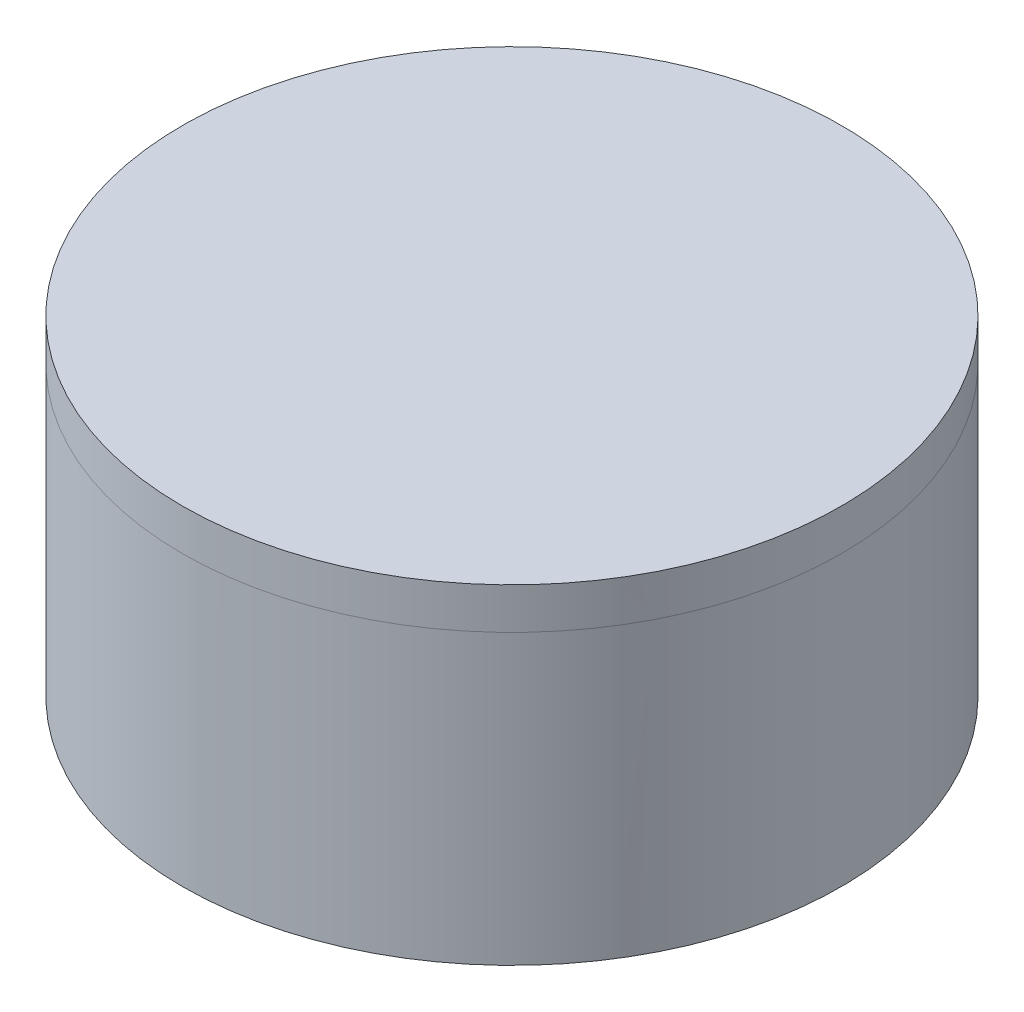
ISO-10303-21;
HEADER;
FILE_DESCRIPTION(('STEP AP214'),'2;1');
FILE_NAME('part.step','',(''),(''),'','','');
FILE_SCHEMA(('AUTOMOTIVE_DESIGN { 1 0 10303 214 1 1 1 1 }'));
ENDSEC;
DATA;
#1=APPLICATION_CONTEXT('core data for automotive mechanical design processes');
#2=APPLICATION_PROTOCOL_DEFINITION('international standard','automotive_design',2000,#1);
#3=PRODUCT_CONTEXT('',#1,'mechanical');
#4=PRODUCT('Part','Part','',(#3));
#5=PRODUCT_RELATED_PRODUCT_CATEGORY('part','',(#4));
#6=PRODUCT_DEFINITION_FORMATION('','',#4);
#7=PRODUCT_DEFINITION_CONTEXT('part definition',#1,'design');
#8=PRODUCT_DEFINITION('design','',#6,#7);
#9=PRODUCT_DEFINITION_SHAPE('','',#8);
#10=(LENGTH_UNIT() NAMED_UNIT(*) SI_UNIT(.MILLI.,.METRE.));
#11=(NAMED_UNIT(*) PLANE_ANGLE_UNIT() SI_UNIT($,.RADIAN.));
#12=(NAMED_UNIT(*) SI_UNIT($,.STERADIAN.) SOLID_ANGLE_UNIT());
#13=UNCERTAINTY_MEASURE_WITH_UNIT(LENGTH_MEASURE(1.E-05),#10,'distance_accuracy_value','');
#14=(GEOMETRIC_REPRESENTATION_CONTEXT(3) GLOBAL_UNCERTAINTY_ASSIGNED_CONTEXT((#13)) GLOBAL_UNIT_ASSIGNED_CONTEXT((#10,
#11,#12)) REPRESENTATION_CONTEXT('',''));
#15=CARTESIAN_POINT('',(0.,0.,0.));
#16=DIRECTION('',(0.,0.,1.));
#17=DIRECTION('',(1.,0.,0.));
#18=AXIS2_PLACEMENT_3D('',#15,#16,#17);
#19=CARTESIAN_POINT('',(0.,22.9999994859099,0.));
#20=DIRECTION('',(0.,-1.,0.));
#21=DIRECTION('',(0.,0.,-1.));
#22=AXIS2_PLACEMENT_3D('',#19,#20,#21);
#23=PLANE('',#22);
#24=CARTESIAN_POINT('',(0.,22.9999994859099,0.));
#25=DIRECTION('',(0.,-1.,0.));
#26=DIRECTION('',(0.,0.,-1.));
#27=AXIS2_PLACEMENT_3D('',#24,#25,#26);
#28=CIRCLE('',#27,40.);
#29=CARTESIAN_POINT('',(0.,22.9999994859099,-40.));
#30=VERTEX_POINT('',#29);
#31=EDGE_CURVE('E52',#30,#30,#28,.F.);
#32=ORIENTED_EDGE('',*,*,#31,.F.);
#33=EDGE_LOOP('',(#32));
#34=FACE_BOUND('',#33,.T.);
#35=ADVANCED_FACE('F48',(#34),#23,.T.);
#36=CARTESIAN_POINT('',(0.,27.9999994859099,0.));
#37=DIRECTION('',(0.,1.,0.));
#38=DIRECTION('',(0.,0.,1.));
#39=AXIS2_PLACEMENT_3D('',#36,#37,#38);
#40=PLANE('',#39);
#41=CARTESIAN_POINT('',(0.,27.9999994859099,0.));
#42=DIRECTION('',(0.,1.,0.));
#43=DIRECTION('',(0.,0.,1.));
#44=AXIS2_PLACEMENT_3D('',#41,#42,#43);
#45=CIRCLE('',#44,40.);
#46=CARTESIAN_POINT('',(0.,27.9999994859099,40.));
#47=VERTEX_POINT('',#46);
#48=EDGE_CURVE('E11',#47,#47,#45,.T.);
#49=ORIENTED_EDGE('',*,*,#48,.T.);
#50=EDGE_LOOP('',(#49));
#51=FACE_BOUND('',#50,.T.);
#52=ADVANCED_FACE('F63',(#51),#40,.T.);
#53=CARTESIAN_POINT('',(0.,-12.0000005140901,0.));
#54=DIRECTION('',(0.,1.,0.));
#55=DIRECTION('',(0.,0.,1.));
#56=AXIS2_PLACEMENT_3D('',#53,#54,#55);
#57=CYLINDRICAL_SURFACE('',#56,40.);
#58=ORIENTED_EDGE('',*,*,#48,.F.);
#59=EDGE_LOOP('',(#58));
#60=FACE_BOUND('',#59,.T.);
#61=ORIENTED_EDGE('',*,*,#31,.T.);
#62=EDGE_LOOP('',(#61));
#63=FACE_BOUND('',#62,.T.);
#64=ADVANCED_FACE('F50',(#60,#63),#57,.T.);
#65=CLOSED_SHELL('',(#35,#52,#64));
#66=MANIFOLD_SOLID_BREP('B2',#65);
#67=CARTESIAN_POINT('',(0.,22.9999994859099,0.));
#68=DIRECTION('',(0.,-1.,0.));
#69=DIRECTION('',(0.,0.,-1.));
#70=AXIS2_PLACEMENT_3D('',#67,#68,#69);
#71=PLANE('',#70);
#72=CARTESIAN_POINT('',(0.,22.9999994859099,0.));
#73=DIRECTION('',(0.,-1.,0.));
#74=DIRECTION('',(1.,0.,0.));
#75=AXIS2_PLACEMENT_3D('',#72,#73,#74);
#76=CIRCLE('',#75,34.9999992735684);
#77=CARTESIAN_POINT('',(-34.9999992735684,22.9999994859099,0.));
#78=VERTEX_POINT('',#77);
#79=EDGE_CURVE('E46',#78,#78,#76,.T.);
#80=ORIENTED_EDGE('',*,*,#79,.T.);
#81=EDGE_LOOP('',(#80));
#82=FACE_BOUND('',#81,.T.);
#83=CARTESIAN_POINT('',(0.,22.9999994859099,0.));
#84=DIRECTION('',(0.,-1.,0.));
#85=DIRECTION('',(0.,0.,-1.));
#86=AXIS2_PLACEMENT_3D('',#83,#84,#85);
#87=CIRCLE('',#86,40.);
#88=CARTESIAN_POINT('',(0.,22.9999994859099,-40.));
#89=VERTEX_POINT('',#88);
#90=EDGE_CURVE('E116',#89,#89,#87,.F.);
#91=ORIENTED_EDGE('',*,*,#90,.T.);
#92=EDGE_LOOP('',(#91));
#93=FACE_BOUND('',#92,.T.);
#94=ADVANCED_FACE('F113',(#82,#93),#71,.F.);
#95=CARTESIAN_POINT('',(0.,22.9999994859099,0.));
#96=DIRECTION('',(0.,-1.,0.));
#97=DIRECTION('',(1.,0.,0.));
#98=AXIS2_PLACEMENT_3D('',#95,#96,#97);
#99=CIRCLE('',#98,32.4999992735684);
#100=CARTESIAN_POINT('',(-32.4999992735684,22.9999994859099,0.));
#101=VERTEX_POINT('',#100);
#102=EDGE_CURVE('E269',#101,#101,#99,.T.);
#103=ORIENTED_EDGE('',*,*,#102,.F.);
#104=EDGE_LOOP('',(#103));
#105=FACE_BOUND('',#104,.T.);
#106=ADVANCED_FACE('F332',(#105),#71,.F.);
#107=CARTESIAN_POINT('',(7.00000010430813,22.4999994970858,0.));
#108=DIRECTION('',(0.,1.,0.));
#109=DIRECTION('',(1.,0.,0.));
#110=AXIS2_PLACEMENT_3D('',#107,#108,#109);
#111=PLANE('',#110);
#112=CARTESIAN_POINT('',(0.,22.4999994970858,0.));
#113=DIRECTION('',(0.,-1.,0.));
#114=DIRECTION('',(1.,0.,0.));
#115=AXIS2_PLACEMENT_3D('',#112,#113,#114);
#116=CIRCLE('',#115,7.00000010430813);
#117=CARTESIAN_POINT('',(-7.00000010430814,22.4999994970858,0.));
#118=VERTEX_POINT('',#117);
#119=EDGE_CURVE('E296',#118,#118,#116,.T.);
#120=ORIENTED_EDGE('',*,*,#119,.T.);
#121=EDGE_LOOP('',(#120));
#122=FACE_BOUND('',#121,.T.);
#123=CARTESIAN_POINT('',(0.,22.4999994970858,0.));
#124=DIRECTION('',(0.,-1.,0.));
#125=DIRECTION('',(1.,0.,0.));
#126=AXIS2_PLACEMENT_3D('',#123,#124,#125);
#127=CIRCLE('',#126,5.00000026077048);
#128=CARTESIAN_POINT('',(-5.0000002607703,22.4999994970858,0.));
#129=VERTEX_POINT('',#128);
#130=EDGE_CURVE('E253',#129,#129,#127,.T.);
#131=ORIENTED_EDGE('',*,*,#130,.F.);
#132=EDGE_LOOP('',(#131));
#133=FACE_BOUND('',#132,.T.);
#134=ADVANCED_FACE('F340',(#122,#133),#111,.F.);
#135=CARTESIAN_POINT('',(0.,18.7499998603016,0.));
#136=DIRECTION('',(0.,-1.,0.));
#137=DIRECTION('',(1.,0.,0.));
#138=AXIS2_PLACEMENT_3D('',#135,#136,#137);
#139=CYLINDRICAL_SURFACE('',#138,5.0000002607703);
#140=CARTESIAN_POINT('',(0.,15.0000002235174,0.));
#141=DIRECTION('',(0.,-1.,0.));
#142=DIRECTION('',(1.,0.,0.));
#143=AXIS2_PLACEMENT_3D('',#140,#141,#142);
#144=CIRCLE('',#143,5.00000026077035);
#145=CARTESIAN_POINT('',(-5.0000002607703,15.0000002235174,0.));
#146=VERTEX_POINT('',#145);
#147=EDGE_CURVE('E252',#146,#146,#144,.T.);
#148=ORIENTED_EDGE('',*,*,#147,.F.);
#149=DIRECTION('',(0.,1.,0.));
#150=VECTOR('',#149,1.);
#151=CARTESIAN_POINT('',(-5.0000002607703,18.7499998603016,0.));
#152=LINE('',#151,#150);
#153=EDGE_CURVE('E249',#146,#129,#152,.T.);
#154=ORIENTED_EDGE('',*,*,#153,.T.);
#155=ORIENTED_EDGE('',*,*,#130,.T.);
#156=ORIENTED_EDGE('',*,*,#153,.F.);
#157=EDGE_LOOP('',(#148,#154,#155,#156));
#158=FACE_BOUND('',#157,.T.);
#159=ADVANCED_FACE('F345',(#158),#139,.T.);
#160=CARTESIAN_POINT('',(5.00000026077035,15.0000002235174,0.));
#161=DIRECTION('',(0.,-1.,0.));
#162=DIRECTION('',(0.,0.,-1.));
#163=AXIS2_PLACEMENT_3D('',#160,#161,#162);
#164=PLANE('',#163);
#165=CARTESIAN_POINT('',(0.,15.0000002235174,0.));
#166=DIRECTION('',(0.,-1.,0.));
#167=DIRECTION('',(1.,0.,0.));
#168=AXIS2_PLACEMENT_3D('',#165,#166,#167);
#169=CIRCLE('',#168,7.00000010430812);
#170=CARTESIAN_POINT('',(7.00000010430812,15.0000002235174,0.));
#171=VERTEX_POINT('',#170);
#172=EDGE_CURVE('E372',#171,#171,#169,.T.);
#173=ORIENTED_EDGE('',*,*,#172,.F.);
#174=EDGE_LOOP('',(#173));
#175=FACE_BOUND('',#174,.T.);
#176=ORIENTED_EDGE('',*,*,#147,.T.);
#177=EDGE_LOOP('',(#176));
#178=FACE_BOUND('',#177,.T.);
#179=ADVANCED_FACE('F492',(#175,#178),#164,.F.);
#180=CARTESIAN_POINT('',(7.00000010430812,15.0000002235174,0.));
#181=CARTESIAN_POINT('',(7.00000010430813,15.0000002235174,7.00000010430813));
#182=CARTESIAN_POINT('',(0.,15.0000002235174,7.00000010430812));
#183=CARTESIAN_POINT('',(-7.00000010430813,15.0000002235174,7.00000010430813));
#184=CARTESIAN_POINT('',(-7.00000010430812,15.0000002235174,0.));
#185=CARTESIAN_POINT('',(-7.00000010430813,15.0000002235174,-7.00000010430813));
#186=CARTESIAN_POINT('',(0.,15.0000002235174,-7.00000010430812));
#187=CARTESIAN_POINT('',(7.00000010430813,15.0000002235174,-7.00000010430813));
#188=CARTESIAN_POINT('',(7.00000010430812,15.0000002235174,0.));
#189=CARTESIAN_POINT('',(11.4638967182208,15.0000002235174,0.));
#190=CARTESIAN_POINT('',(11.4638967182208,15.0000002235174,11.4638967182208));
#191=CARTESIAN_POINT('',(0.,15.0000002235174,11.4638967182208));
#192=CARTESIAN_POINT('',(-11.4638967182208,15.0000002235174,11.4638967182208));
#193=CARTESIAN_POINT('',(-11.4638967182208,15.0000002235174,0.));
#194=CARTESIAN_POINT('',(-11.4638967182208,15.0000002235174,-11.4638967182208));
#195=CARTESIAN_POINT('',(0.,15.0000002235174,-11.4638967182208));
#196=CARTESIAN_POINT('',(11.4638967182208,15.0000002235174,-11.4638967182208));
#197=CARTESIAN_POINT('',(11.4638967182208,15.0000002235174,0.));
#198=CARTESIAN_POINT('',(15.4070193908431,2.99020234831918,0.));
#199=CARTESIAN_POINT('',(15.4070193908431,2.99020234831918,15.4070193908431));
#200=CARTESIAN_POINT('',(0.,2.99020234831917,15.4070193908431));
#201=CARTESIAN_POINT('',(-15.4070193908431,2.99020234831916,15.4070193908431));
#202=CARTESIAN_POINT('',(-15.4070193908431,2.99020234831916,0.));
#203=CARTESIAN_POINT('',(-15.4070193908431,2.99020234831916,-15.4070193908431));
#204=CARTESIAN_POINT('',(0.,2.99020234831917,-15.4070193908431));
#205=CARTESIAN_POINT('',(15.4070193908431,2.99020234831918,-15.4070193908431));
#206=CARTESIAN_POINT('',(15.4070193908431,2.99020234831918,0.));
#207=(BOUNDED_SURFACE() B_SPLINE_SURFACE(2,2,((#180,#181,#182,#183,#184,#185,#186,#187,#188),
(#189,#190,#191,#192,#193,#194,#195,#196,#197),(#198,#199,#200,#201,#202,#203,#204,#205,#206)),
.UNSPECIFIED.,.F.,.T.,.F.) B_SPLINE_SURFACE_WITH_KNOTS((3,3),(3,2,2,2,3),(0.,0.487863217026215),
(0.,1.5707963267949,3.14159265358979,4.71238898038469,6.28318530717959),
.UNSPECIFIED.) GEOMETRIC_REPRESENTATION_ITEM() RATIONAL_B_SPLINE_SURFACE(((1.,0.707106781186548,
1.,0.707106781186548,1.,0.707106781186548,1.,0.707106781186548,1.),(0.970395916349225,
0.686173532886271,0.970395916349225,0.686173532886271,0.970395916349225,0.686173532886271,
0.970395916349225,0.686173532886271,0.970395916349225),(1.,0.707106781186548,1.,
0.707106781186548,1.,0.707106781186548,1.,0.707106781186548,1.))) REPRESENTATION_ITEM('') SURFACE());
#208=CARTESIAN_POINT('',(7.00000010430813,-87.9438912009362,0.));
#209=DIRECTION('',(0.,0.,1.));
#210=DIRECTION('',(0.,1.,0.));
#211=AXIS2_PLACEMENT_3D('',#208,#209,#210);
#212=ELLIPSE('',#211,102.943891424454,17.9353777082701);
#213=CARTESIAN_POINT('',(15.4070193908431,2.99020234831918,0.));
#214=VERTEX_POINT('',#213);
#215=EDGE_CURVE('E368',#214,#171,#212,.T.);
#216=CARTESIAN_POINT('',(0.,2.99020234831917,0.));
#217=DIRECTION('',(0.,-1.,0.));
#218=DIRECTION('',(1.,0.,0.));
#219=AXIS2_PLACEMENT_3D('',#216,#217,#218);
#220=CIRCLE('',#219,15.4070193908431);
#221=CARTESIAN_POINT('',(-15.4070193908431,2.99020234831916,0.));
#222=VERTEX_POINT('',#221);
#223=EDGE_CURVE('E314',#222,#214,#220,.T.);
#224=CARTESIAN_POINT('',(0.,2.99020234831917,0.));
#225=DIRECTION('',(0.,-1.,0.));
#226=DIRECTION('',(1.,0.,0.));
#227=AXIS2_PLACEMENT_3D('',#224,#225,#226);
#228=CIRCLE('',#227,15.4070193908431);
#229=EDGE_CURVE('E311',#214,#222,#228,.T.);
#230=ORIENTED_EDGE('',*,*,#215,.T.);
#231=ORIENTED_EDGE('',*,*,#172,.T.);
#232=ORIENTED_EDGE('',*,*,#215,.F.);
#233=ORIENTED_EDGE('',*,*,#223,.F.);
#234=ORIENTED_EDGE('',*,*,#229,.F.);
#235=EDGE_LOOP('',(#230,#231,#232,#233,#234));
#236=FACE_BOUND('',#235,.T.);
#237=ADVANCED_FACE('F490',(#236),#207,.F.);
#238=CARTESIAN_POINT('',(0.,-1.39440685149006,0.));
#239=DIRECTION('',(0.,-1.,0.));
#240=DIRECTION('',(1.,0.,0.));
#241=AXIS2_PLACEMENT_3D('',#238,#239,#240);
#242=CONICAL_SURFACE('',#241,16.8465983184835,0.317236737188055);
#243=CARTESIAN_POINT('',(0.,-5.7790160512793,0.));
#244=DIRECTION('',(0.,-1.,0.));
#245=DIRECTION('',(1.,0.,0.));
#246=AXIS2_PLACEMENT_3D('',#243,#244,#245);
#247=CIRCLE('',#246,18.2861772461849);
#248=CARTESIAN_POINT('',(-18.286177246124,-5.7790160512993,0.));
#249=VERTEX_POINT('',#248);
#250=CARTESIAN_POINT('',(0.,-5.7790160512793,18.2861772461849));
#251=VERTEX_POINT('',#250);
#252=EDGE_CURVE('E248',#249,#251,#247,.T.);
#253=ORIENTED_EDGE('',*,*,#252,.F.);
#254=DIRECTION('',(0.311942376068758,0.950101023056274,0.));
#255=VECTOR('',#254,1.);
#256=CARTESIAN_POINT('',(-16.8465983184835,-1.39440685149007,0.));
#257=LINE('',#256,#255);
#258=EDGE_CURVE('E301',#249,#222,#257,.T.);
#259=ORIENTED_EDGE('',*,*,#258,.T.);
#260=ORIENTED_EDGE('',*,*,#223,.T.);
#261=ORIENTED_EDGE('',*,*,#229,.T.);
#262=ORIENTED_EDGE('',*,*,#258,.F.);
#263=CARTESIAN_POINT('',(0.,-5.7790160512793,0.));
#264=DIRECTION('',(0.,-1.,0.));
#265=DIRECTION('',(1.,0.,0.));
#266=AXIS2_PLACEMENT_3D('',#263,#264,#265);
#267=CIRCLE('',#266,18.2861772461849);
#268=EDGE_CURVE('E277',#251,#249,#267,.T.);
#269=ORIENTED_EDGE('',*,*,#268,.F.);
#270=EDGE_LOOP('',(#253,#259,#260,#261,#262,#269));
#271=FACE_BOUND('',#270,.T.);
#272=ADVANCED_FACE('F486',(#271),#242,.T.);
#273=CARTESIAN_POINT('',(0.,-5.15511608585867,0.));
#274=DIRECTION('',(0.,-1.,0.));
#275=DIRECTION('',(0.,0.,-1.));
#276=AXIS2_PLACEMENT_3D('',#273,#274,#275);
#277=TOROIDAL_SURFACE('',#276,20.1863742973214,2.);
#278=ORIENTED_EDGE('',*,*,#252,.T.);
#279=CARTESIAN_POINT('',(0.,-5.15511608585867,20.1863742973214));
#280=DIRECTION('',(-1.,0.,0.));
#281=DIRECTION('',(0.,0.,1.));
#282=AXIS2_PLACEMENT_3D('',#279,#280,#281);
#283=CIRCLE('',#282,2.);
#284=CARTESIAN_POINT('',(0.,-6.04954325699569,21.9752286892527));
#285=VERTEX_POINT('',#284);
#286=EDGE_CURVE('E243',#251,#285,#283,.T.);
#287=ORIENTED_EDGE('',*,*,#286,.T.);
#288=CARTESIAN_POINT('',(0.,-6.04954325699569,0.));
#289=DIRECTION('',(0.,-1.,0.));
#290=DIRECTION('',(1.,0.,0.));
#291=AXIS2_PLACEMENT_3D('',#288,#289,#290);
#292=CIRCLE('',#291,21.9752286892527);
#293=CARTESIAN_POINT('',(-21.9752286892527,-6.0495432569957,0.));
#294=VERTEX_POINT('',#293);
#295=EDGE_CURVE('E244',#294,#285,#292,.T.);
#296=ORIENTED_EDGE('',*,*,#295,.F.);
#297=CARTESIAN_POINT('',(0.,-6.04954325699569,0.));
#298=DIRECTION('',(0.,-1.,0.));
#299=DIRECTION('',(1.,0.,0.));
#300=AXIS2_PLACEMENT_3D('',#297,#298,#299);
#301=CIRCLE('',#300,21.9752286892527);
#302=EDGE_CURVE('E239',#285,#294,#301,.T.);
#303=ORIENTED_EDGE('',*,*,#302,.F.);
#304=ORIENTED_EDGE('',*,*,#286,.F.);
#305=ORIENTED_EDGE('',*,*,#268,.T.);
#306=EDGE_LOOP('',(#278,#287,#296,#303,#304,#305));
#307=FACE_BOUND('',#306,.T.);
#308=ADVANCED_FACE('F518',(#307),#277,.F.);
#309=CARTESIAN_POINT('',(0.,6.76408207459843,0.));
#310=DIRECTION('',(0.,1.,0.));
#311=DIRECTION('',(1.,0.,0.));
#312=AXIS2_PLACEMENT_3D('',#309,#310,#311);
#313=CONICAL_SURFACE('',#312,28.3820411773715,0.46364759790772);
#314=ORIENTED_EDGE('',*,*,#295,.T.);
#315=ORIENTED_EDGE('',*,*,#302,.T.);
#316=DIRECTION('',(-0.447213585578001,0.894427195960895,0.));
#317=VECTOR('',#316,1.);
#318=CARTESIAN_POINT('',(-28.3820411773715,6.76408207459841,0.));
#319=LINE('',#318,#317);
#320=CARTESIAN_POINT('',(-34.7888536654902,19.5777074061925,0.));
#321=VERTEX_POINT('',#320);
#322=EDGE_CURVE('E289',#294,#321,#319,.T.);
#323=ORIENTED_EDGE('',*,*,#322,.T.);
#324=CARTESIAN_POINT('',(0.,19.5777074061925,0.));
#325=DIRECTION('',(0.,-1.,0.));
#326=DIRECTION('',(1.,0.,0.));
#327=AXIS2_PLACEMENT_3D('',#324,#325,#326);
#328=CIRCLE('',#327,34.7888536654902);
#329=CARTESIAN_POINT('',(0.,19.5777074061925,34.7888536654902));
#330=VERTEX_POINT('',#329);
#331=EDGE_CURVE('E262',#330,#321,#328,.T.);
#332=ORIENTED_EDGE('',*,*,#331,.F.);
#333=CARTESIAN_POINT('',(0.,19.5777074061925,0.));
#334=DIRECTION('',(0.,-1.,0.));
#335=DIRECTION('',(1.,0.,0.));
#336=AXIS2_PLACEMENT_3D('',#333,#334,#335);
#337=CIRCLE('',#336,34.7888536654902);
#338=EDGE_CURVE('E265',#321,#330,#337,.T.);
#339=ORIENTED_EDGE('',*,*,#338,.F.);
#340=ORIENTED_EDGE('',*,*,#322,.F.);
#341=EDGE_LOOP('',(#314,#315,#323,#332,#339,#340));
#342=FACE_BOUND('',#341,.T.);
#343=ADVANCED_FACE('F514',(#342),#313,.F.);
#344=CARTESIAN_POINT('',(0.,20.4721345773485,0.));
#345=DIRECTION('',(0.,-1.,0.));
#346=DIRECTION('',(0.,0.,-1.));
#347=AXIS2_PLACEMENT_3D('',#344,#345,#346);
#348=TOROIDAL_SURFACE('',#347,32.9999992735684,2.);
#349=ORIENTED_EDGE('',*,*,#338,.T.);
#350=CARTESIAN_POINT('',(0.,20.4721345773485,32.9999992735684));
#351=DIRECTION('',(-1.,0.,0.));
#352=DIRECTION('',(0.,0.,1.));
#353=AXIS2_PLACEMENT_3D('',#350,#351,#352);
#354=CIRCLE('',#353,2.);
#355=CARTESIAN_POINT('',(0.,20.4721345773485,34.9999992735684));
#356=VERTEX_POINT('',#355);
#357=EDGE_CURVE('E290',#330,#356,#354,.T.);
#358=ORIENTED_EDGE('',*,*,#357,.T.);
#359=CARTESIAN_POINT('',(0.,20.4721345773485,0.));
#360=DIRECTION('',(0.,-1.,0.));
#361=DIRECTION('',(1.,0.,0.));
#362=AXIS2_PLACEMENT_3D('',#359,#360,#361);
#363=CIRCLE('',#362,34.9999992735684);
#364=CARTESIAN_POINT('',(-34.9999992735684,20.4721345773485,0.));
#365=VERTEX_POINT('',#364);
#366=EDGE_CURVE('E285',#365,#356,#363,.T.);
#367=ORIENTED_EDGE('',*,*,#366,.F.);
#368=CARTESIAN_POINT('',(0.,20.4721345773485,0.));
#369=DIRECTION('',(0.,-1.,0.));
#370=DIRECTION('',(1.,0.,0.));
#371=AXIS2_PLACEMENT_3D('',#368,#369,#370);
#372=CIRCLE('',#371,34.9999992735684);
#373=EDGE_CURVE('E288',#356,#365,#372,.T.);
#374=ORIENTED_EDGE('',*,*,#373,.F.);
#375=ORIENTED_EDGE('',*,*,#357,.F.);
#376=ORIENTED_EDGE('',*,*,#331,.T.);
#377=EDGE_LOOP('',(#349,#358,#367,#374,#375,#376));
#378=FACE_BOUND('',#377,.T.);
#379=ADVANCED_FACE('F511',(#378),#348,.F.);
#380=CARTESIAN_POINT('',(0.,21.7360670316292,0.));
#381=DIRECTION('',(0.,-1.,0.));
#382=DIRECTION('',(1.,0.,0.));
#383=AXIS2_PLACEMENT_3D('',#380,#381,#382);
#384=CYLINDRICAL_SURFACE('',#383,34.9999992735684);
#385=ORIENTED_EDGE('',*,*,#366,.T.);
#386=ORIENTED_EDGE('',*,*,#373,.T.);
#387=DIRECTION('',(0.,1.,0.));
#388=VECTOR('',#387,1.);
#389=CARTESIAN_POINT('',(-34.9999992735684,21.7360670316292,0.));
#390=LINE('',#389,#388);
#391=EDGE_CURVE('E273',#365,#78,#390,.T.);
#392=ORIENTED_EDGE('',*,*,#391,.T.);
#393=ORIENTED_EDGE('',*,*,#79,.F.);
#394=ORIENTED_EDGE('',*,*,#391,.F.);
#395=EDGE_LOOP('',(#385,#386,#392,#393,#394));
#396=FACE_BOUND('',#395,.T.);
#397=ADVANCED_FACE('F505',(#396),#384,.F.);
#398=CARTESIAN_POINT('',(0.,19.7499998603016,0.));
#399=DIRECTION('',(0.,-1.,0.));
#400=DIRECTION('',(1.,0.,0.));
#401=AXIS2_PLACEMENT_3D('',#398,#399,#400);
#402=CYLINDRICAL_SURFACE('',#401,7.00000010430813);
#403=CARTESIAN_POINT('',(0.,17.0000002235174,0.));
#404=DIRECTION('',(0.,-1.,0.));
#405=DIRECTION('',(1.,0.,0.));
#406=AXIS2_PLACEMENT_3D('',#403,#404,#405);
#407=CIRCLE('',#406,7.00000010431072);
#408=CARTESIAN_POINT('',(7.00000010431072,17.0000002235174,0.));
#409=VERTEX_POINT('',#408);
#410=CARTESIAN_POINT('',(-7.00000010430813,17.0000002235174,0.));
#411=VERTEX_POINT('',#410);
#412=EDGE_CURVE('E388',#409,#411,#407,.T.);
#413=ORIENTED_EDGE('',*,*,#412,.T.);
#414=DIRECTION('',(0.,1.,0.));
#415=VECTOR('',#414,1.);
#416=CARTESIAN_POINT('',(-7.00000010430814,19.7499998603016,0.));
#417=LINE('',#416,#415);
#418=EDGE_CURVE('E261',#411,#118,#417,.T.);
#419=ORIENTED_EDGE('',*,*,#418,.T.);
#420=ORIENTED_EDGE('',*,*,#119,.F.);
#421=ORIENTED_EDGE('',*,*,#418,.F.);
#422=CARTESIAN_POINT('',(0.,17.0000002235174,0.));
#423=DIRECTION('',(0.,-1.,0.));
#424=DIRECTION('',(1.,0.,0.));
#425=AXIS2_PLACEMENT_3D('',#422,#423,#424);
#426=CIRCLE('',#425,7.00000010431072);
#427=EDGE_CURVE('E310',#411,#409,#426,.T.);
#428=ORIENTED_EDGE('',*,*,#427,.T.);
#429=EDGE_LOOP('',(#413,#419,#420,#421,#428));
#430=FACE_BOUND('',#429,.T.);
#431=ADVANCED_FACE('F549',(#430),#402,.F.);
#432=CARTESIAN_POINT('',(17.4627620833848,3.03210349645566,0.));
#433=CARTESIAN_POINT('',(17.4627620833848,3.03210349645566,17.4627620833848));
#434=CARTESIAN_POINT('',(0.,3.03210349645565,17.4627620833848));
#435=CARTESIAN_POINT('',(-17.4627620833848,3.03210349645564,17.4627620833848));
#436=CARTESIAN_POINT('',(-17.4627620833848,3.03210349645564,0.));
#437=CARTESIAN_POINT('',(-17.4627620833848,3.03210349645564,-17.4627620833848));
#438=CARTESIAN_POINT('',(0.,3.03210349645565,-17.4627620833848));
#439=CARTESIAN_POINT('',(17.4627620833848,3.03210349645566,-17.4627620833848));
#440=CARTESIAN_POINT('',(17.4627620833848,3.03210349645566,0.));
#441=CARTESIAN_POINT('',(12.8598456146047,17.0000002235187,0.));
#442=CARTESIAN_POINT('',(12.8598456146047,17.0000002235187,12.8598456146047));
#443=CARTESIAN_POINT('',(0.,17.0000002235187,12.8598456146047));
#444=CARTESIAN_POINT('',(-12.8598456146047,17.0000002235187,12.8598456146047));
#445=CARTESIAN_POINT('',(-12.8598456146047,17.0000002235187,0.));
#446=CARTESIAN_POINT('',(-12.8598456146047,17.0000002235187,-12.8598456146047));
#447=CARTESIAN_POINT('',(0.,17.0000002235187,-12.8598456146047));
#448=CARTESIAN_POINT('',(12.8598456146047,17.0000002235187,-12.8598456146047));
#449=CARTESIAN_POINT('',(12.8598456146047,17.0000002235187,0.));
#450=CARTESIAN_POINT('',(7.00000010431072,17.0000002235174,0.));
#451=CARTESIAN_POINT('',(7.00000010431071,17.0000002235174,7.00000010431071));
#452=CARTESIAN_POINT('',(0.,17.0000002235174,7.00000010431072));
#453=CARTESIAN_POINT('',(-7.00000010431071,17.0000002235174,7.00000010431071));
#454=CARTESIAN_POINT('',(-7.00000010431073,17.0000002235174,0.));
#455=CARTESIAN_POINT('',(-7.00000010431071,17.0000002235174,-7.00000010431071));
#456=CARTESIAN_POINT('',(0.,17.0000002235174,-7.00000010431072));
#457=CARTESIAN_POINT('',(7.00000010431071,17.0000002235174,-7.00000010431071));
#458=CARTESIAN_POINT('',(7.00000010431072,17.0000002235174,0.));
#459=(BOUNDED_SURFACE() B_SPLINE_SURFACE(2,2,((#432,#433,#434,#435,#436,#437,#438,#439,#440),
(#441,#442,#443,#444,#445,#446,#447,#448,#449),(#450,#451,#452,#453,#454,#455,#456,#457,#458)),
.UNSPECIFIED.,.F.,.T.,.F.) B_SPLINE_SURFACE_WITH_KNOTS((3,3),(3,2,2,2,3),(-0.667290521982324,
0.),(0.,1.5707963267949,3.14159265358979,4.71238898038469,6.28318530717959),
.UNSPECIFIED.) GEOMETRIC_REPRESENTATION_ITEM() RATIONAL_B_SPLINE_SURFACE(((1.,0.707106781186548,
1.,0.707106781186548,1.,0.707106781186548,1.,0.707106781186548,1.),(0.944854839269347,
0.668113264084281,0.944854839269347,0.668113264084281,0.944854839269347,0.668113264084281,
0.944854839269347,0.668113264084281,0.944854839269347),(1.,0.707106781186548,1.,
0.707106781186548,1.,0.707106781186548,1.,0.707106781186548,1.))) REPRESENTATION_ITEM('') SURFACE());
#460=CARTESIAN_POINT('',(7.00000010432563,-48.1188045942484,0.));
#461=DIRECTION('',(0.,0.,-1.));
#462=DIRECTION('',(-2.28937523180703E-13,1.,0.));
#463=AXIS2_PLACEMENT_3D('',#460,#461,#462);
#464=ELLIPSE('',#463,65.1188048177658,16.906509728426);
#465=CARTESIAN_POINT('',(17.4627620842272,3.03210349656659,0.));
#466=VERTEX_POINT('',#465);
#467=EDGE_CURVE('E306',#409,#466,#464,.T.);
#468=CARTESIAN_POINT('',(0.,3.03210349656658,0.));
#469=DIRECTION('',(0.,-1.,0.));
#470=DIRECTION('',(1.,0.,0.));
#471=AXIS2_PLACEMENT_3D('',#468,#469,#470);
#472=CIRCLE('',#471,17.4627620842272);
#473=CARTESIAN_POINT('',(-17.4627620842272,3.03210349656657,0.));
#474=VERTEX_POINT('',#473);
#475=EDGE_CURVE('E222',#466,#474,#472,.T.);
#476=CARTESIAN_POINT('',(0.,3.03210349656658,0.));
#477=DIRECTION('',(0.,-1.,0.));
#478=DIRECTION('',(1.,0.,0.));
#479=AXIS2_PLACEMENT_3D('',#476,#477,#478);
#480=CIRCLE('',#479,17.4627620842272);
#481=EDGE_CURVE('E230',#474,#466,#480,.T.);
#482=ORIENTED_EDGE('',*,*,#467,.T.);
#483=ORIENTED_EDGE('',*,*,#475,.T.);
#484=ORIENTED_EDGE('',*,*,#481,.T.);
#485=ORIENTED_EDGE('',*,*,#467,.F.);
#486=ORIENTED_EDGE('',*,*,#427,.F.);
#487=ORIENTED_EDGE('',*,*,#412,.F.);
#488=EDGE_LOOP('',(#482,#483,#484,#485,#486,#487));
#489=FACE_BOUND('',#488,.T.);
#490=ADVANCED_FACE('F521',(#489),#459,.F.);
#491=CARTESIAN_POINT('',(0.,-0.115621357824854,0.));
#492=DIRECTION('',(0.,-1.,0.));
#493=DIRECTION('',(1.,0.,0.));
#494=AXIS2_PLACEMENT_3D('',#491,#492,#493);
#495=CONICAL_SURFACE('',#494,18.5000659776928,0.31833343610865);
#496=CARTESIAN_POINT('',(0.,-3.26334621221628,0.));
#497=DIRECTION('',(0.,-1.,0.));
#498=DIRECTION('',(1.,0.,0.));
#499=AXIS2_PLACEMENT_3D('',#496,#497,#498);
#500=CIRCLE('',#499,19.5373698711585);
#501=CARTESIAN_POINT('',(-19.5373698711585,-3.26334621221629,0.));
#502=VERTEX_POINT('',#501);
#503=CARTESIAN_POINT('',(0.,-3.26334621221628,19.5373698711585));
#504=VERTEX_POINT('',#503);
#505=EDGE_CURVE('E238',#502,#504,#500,.T.);
#506=ORIENTED_EDGE('',*,*,#505,.T.);
#507=CARTESIAN_POINT('',(0.,-3.26334621221628,0.));
#508=DIRECTION('',(0.,-1.,0.));
#509=DIRECTION('',(1.,0.,0.));
#510=AXIS2_PLACEMENT_3D('',#507,#508,#509);
#511=CIRCLE('',#510,19.5373698711585);
#512=EDGE_CURVE('E223',#504,#502,#511,.T.);
#513=ORIENTED_EDGE('',*,*,#512,.T.);
#514=DIRECTION('',(0.312984163032231,0.949758344891485,0.));
#515=VECTOR('',#514,1.);
#516=CARTESIAN_POINT('',(-18.5000659776928,-0.115621357824865,0.));
#517=LINE('',#516,#515);
#518=EDGE_CURVE('E217',#502,#474,#517,.T.);
#519=ORIENTED_EDGE('',*,*,#518,.T.);
#520=ORIENTED_EDGE('',*,*,#475,.F.);
#521=ORIENTED_EDGE('',*,*,#481,.F.);
#522=ORIENTED_EDGE('',*,*,#518,.F.);
#523=EDGE_LOOP('',(#506,#513,#519,#520,#521,#522));
#524=FACE_BOUND('',#523,.T.);
#525=ADVANCED_FACE('F414',(#524),#495,.F.);
#526=CARTESIAN_POINT('',(0.,-5.15511608585867,0.));
#527=DIRECTION('',(0.,-1.,0.));
#528=DIRECTION('',(0.,0.,-1.));
#529=AXIS2_PLACEMENT_3D('',#526,#527,#528);
#530=TOROIDAL_SURFACE('',#529,20.1863742973214,2.);
#531=CARTESIAN_POINT('',(0.,-3.24309269765819,0.));
#532=DIRECTION('',(0.,-1.,0.));
#533=DIRECTION('',(1.,0.,0.));
#534=AXIS2_PLACEMENT_3D('',#531,#532,#533);
#535=CIRCLE('',#534,19.5997171888037);
#536=CARTESIAN_POINT('',(0.,-3.24309269765819,19.5997171888037));
#537=VERTEX_POINT('',#536);
#538=EDGE_CURVE('E211',#537,#537,#535,.T.);
#539=ORIENTED_EDGE('',*,*,#538,.T.);
#540=CARTESIAN_POINT('',(0.,-5.15511608585867,20.1863742973214));
#541=DIRECTION('',(-1.,0.,0.));
#542=DIRECTION('',(0.,0.,1.));
#543=AXIS2_PLACEMENT_3D('',#540,#541,#542);
#544=CIRCLE('',#543,2.);
#545=EDGE_CURVE('E219',#537,#504,#544,.T.);
#546=ORIENTED_EDGE('',*,*,#545,.T.);
#547=ORIENTED_EDGE('',*,*,#505,.F.);
#548=ORIENTED_EDGE('',*,*,#512,.F.);
#549=ORIENTED_EDGE('',*,*,#545,.F.);
#550=EDGE_LOOP('',(#539,#546,#547,#548,#549));
#551=FACE_BOUND('',#550,.T.);
#552=ADVANCED_FACE('F423',(#551),#530,.F.);
#553=CARTESIAN_POINT('',(0.,-2.61241251993775,0.));
#554=DIRECTION('',(0.,-1.,0.));
#555=DIRECTION('',(0.,0.,-1.));
#556=AXIS2_PLACEMENT_3D('',#553,#554,#555);
#557=TOROIDAL_SURFACE('',#556,20.3757600442122,1.);
#558=ORIENTED_EDGE('',*,*,#538,.F.);
#559=CARTESIAN_POINT('',(0.,-2.61241251993775,20.3757600442122));
#560=DIRECTION('',(-1.,0.,0.));
#561=DIRECTION('',(0.,0.,1.));
#562=AXIS2_PLACEMENT_3D('',#559,#560,#561);
#563=CIRCLE('',#562,1.);
#564=CARTESIAN_POINT('',(0.,-3.35109854595748,21.0498097122361));
#565=VERTEX_POINT('',#564);
#566=EDGE_CURVE('E206',#537,#565,#563,.T.);
#567=ORIENTED_EDGE('',*,*,#566,.T.);
#568=CARTESIAN_POINT('',(0.,-3.35109854595748,0.));
#569=DIRECTION('',(0.,-1.,0.));
#570=DIRECTION('',(1.,0.,0.));
#571=AXIS2_PLACEMENT_3D('',#568,#569,#570);
#572=CIRCLE('',#571,21.0498097122361);
#573=EDGE_CURVE('E202',#565,#565,#572,.T.);
#574=ORIENTED_EDGE('',*,*,#573,.T.);
#575=ORIENTED_EDGE('',*,*,#566,.F.);
#576=EDGE_LOOP('',(#558,#567,#574,#575));
#577=FACE_BOUND('',#576,.T.);
#578=ADVANCED_FACE('F429',(#577),#557,.T.);
#579=CARTESIAN_POINT('',(0.,-5.15511608585867,0.));
#580=DIRECTION('',(0.,-1.,0.));
#581=DIRECTION('',(0.,0.,-1.));
#582=AXIS2_PLACEMENT_3D('',#579,#580,#581);
#583=TOROIDAL_SURFACE('',#582,20.1863742973214,2.);
#584=CARTESIAN_POINT('',(0.,-3.3809216134767,0.));
#585=DIRECTION('',(0.,-1.,0.));
#586=DIRECTION('',(1.,0.,0.));
#587=AXIS2_PLACEMENT_3D('',#584,#585,#586);
#588=CIRCLE('',#587,21.1095394906478);
#589=CARTESIAN_POINT('',(-21.1095394906478,-3.38092161347672,0.));
#590=VERTEX_POINT('',#589);
#591=CARTESIAN_POINT('',(0.,-3.3809216134767,21.1095394906478));
#592=VERTEX_POINT('',#591);
#593=EDGE_CURVE('E191',#590,#592,#588,.T.);
#594=ORIENTED_EDGE('',*,*,#593,.T.);
#595=CARTESIAN_POINT('',(0.,-5.15511608585867,20.1863742973214));
#596=DIRECTION('',(-1.,0.,0.));
#597=DIRECTION('',(0.,0.,1.));
#598=AXIS2_PLACEMENT_3D('',#595,#596,#597);
#599=CIRCLE('',#598,2.);
#600=EDGE_CURVE('E200',#592,#565,#599,.T.);
#601=ORIENTED_EDGE('',*,*,#600,.T.);
#602=ORIENTED_EDGE('',*,*,#573,.F.);
#603=ORIENTED_EDGE('',*,*,#600,.F.);
#604=CARTESIAN_POINT('',(0.,-3.3809216134767,0.));
#605=DIRECTION('',(0.,-1.,0.));
#606=DIRECTION('',(1.,0.,0.));
#607=AXIS2_PLACEMENT_3D('',#604,#605,#606);
#608=CIRCLE('',#607,21.1095394906478);
#609=EDGE_CURVE('E187',#592,#590,#608,.T.);
#610=ORIENTED_EDGE('',*,*,#609,.T.);
#611=EDGE_LOOP('',(#594,#601,#602,#603,#610));
#612=FACE_BOUND('',#611,.T.);
#613=ADVANCED_FACE('F198',(#612),#583,.F.);
#614=CARTESIAN_POINT('',(0.,7.9039656783654,0.));
#615=DIRECTION('',(0.,1.,0.));
#616=DIRECTION('',(1.,0.,0.));
#617=AXIS2_PLACEMENT_3D('',#614,#615,#616);
#618=CONICAL_SURFACE('',#617,26.7519829800886,0.463647597907719);
#619=ORIENTED_EDGE('',*,*,#593,.F.);
#620=DIRECTION('',(-0.447213585578,0.894427195960895,0.));
#621=VECTOR('',#620,1.);
#622=CARTESIAN_POINT('',(-26.7519829800886,7.90396567836539,0.));
#623=LINE('',#622,#621);
#624=CARTESIAN_POINT('',(-32.3944264695293,19.1888529702075,0.));
#625=VERTEX_POINT('',#624);
#626=EDGE_CURVE('E192',#590,#625,#623,.T.);
#627=ORIENTED_EDGE('',*,*,#626,.T.);
#628=CARTESIAN_POINT('',(0.,19.1888529702075,0.));
#629=DIRECTION('',(0.,-1.,0.));
#630=DIRECTION('',(1.,0.,0.));
#631=AXIS2_PLACEMENT_3D('',#628,#629,#630);
#632=CIRCLE('',#631,32.3944264695293);
#633=CARTESIAN_POINT('',(0.,19.1888529702075,32.3944264695293));
#634=VERTEX_POINT('',#633);
#635=EDGE_CURVE('E302',#625,#634,#632,.T.);
#636=ORIENTED_EDGE('',*,*,#635,.T.);
#637=CARTESIAN_POINT('',(0.,19.1888529702075,0.));
#638=DIRECTION('',(0.,-1.,0.));
#639=DIRECTION('',(1.,0.,0.));
#640=AXIS2_PLACEMENT_3D('',#637,#638,#639);
#641=CIRCLE('',#640,32.3944264695293);
#642=EDGE_CURVE('E231',#634,#625,#641,.T.);
#643=ORIENTED_EDGE('',*,*,#642,.T.);
#644=ORIENTED_EDGE('',*,*,#626,.F.);
#645=ORIENTED_EDGE('',*,*,#609,.F.);
#646=EDGE_LOOP('',(#619,#627,#636,#643,#644,#645));
#647=FACE_BOUND('',#646,.T.);
#648=ADVANCED_FACE('F189',(#647),#618,.T.);
#649=CARTESIAN_POINT('',(0.,19.6360665557855,0.));
#650=DIRECTION('',(0.,-1.,0.));
#651=DIRECTION('',(0.,0.,-1.));
#652=AXIS2_PLACEMENT_3D('',#649,#650,#651);
#653=TOROIDAL_SURFACE('',#652,31.4999992735684,1.);
#654=ORIENTED_EDGE('',*,*,#635,.F.);
#655=ORIENTED_EDGE('',*,*,#642,.F.);
#656=CARTESIAN_POINT('',(0.,19.6360665557855,31.4999992735684));
#657=DIRECTION('',(-1.,0.,0.));
#658=DIRECTION('',(0.,0.,1.));
#659=AXIS2_PLACEMENT_3D('',#656,#657,#658);
#660=CIRCLE('',#659,1.);
#661=CARTESIAN_POINT('',(0.,19.6360665557855,32.4999992735684));
#662=VERTEX_POINT('',#661);
#663=EDGE_CURVE('E139',#634,#662,#660,.T.);
#664=ORIENTED_EDGE('',*,*,#663,.T.);
#665=CARTESIAN_POINT('',(0.,19.6360665557855,0.));
#666=DIRECTION('',(0.,-1.,0.));
#667=DIRECTION('',(1.,0.,0.));
#668=AXIS2_PLACEMENT_3D('',#665,#666,#667);
#669=CIRCLE('',#668,32.4999992735684);
#670=CARTESIAN_POINT('',(-32.4999992735684,19.6360665557855,0.));
#671=VERTEX_POINT('',#670);
#672=EDGE_CURVE('E281',#662,#671,#669,.T.);
#673=ORIENTED_EDGE('',*,*,#672,.T.);
#674=CARTESIAN_POINT('',(0.,19.6360665557855,0.));
#675=DIRECTION('',(0.,-1.,0.));
#676=DIRECTION('',(1.,0.,0.));
#677=AXIS2_PLACEMENT_3D('',#674,#675,#676);
#678=CIRCLE('',#677,32.4999992735684);
#679=EDGE_CURVE('E233',#671,#662,#678,.T.);
#680=ORIENTED_EDGE('',*,*,#679,.T.);
#681=ORIENTED_EDGE('',*,*,#663,.F.);
#682=EDGE_LOOP('',(#654,#655,#664,#673,#680,#681));
#683=FACE_BOUND('',#682,.T.);
#684=ADVANCED_FACE('F333',(#683),#653,.T.);
#685=CARTESIAN_POINT('',(0.,21.3180330208477,0.));
#686=DIRECTION('',(0.,-1.,0.));
#687=DIRECTION('',(1.,0.,0.));
#688=AXIS2_PLACEMENT_3D('',#685,#686,#687);
#689=CYLINDRICAL_SURFACE('',#688,32.4999992735684);
#690=ORIENTED_EDGE('',*,*,#679,.F.);
#691=DIRECTION('',(0.,1.,0.));
#692=VECTOR('',#691,1.);
#693=CARTESIAN_POINT('',(-32.4999992735684,21.3180330208477,0.));
#694=LINE('',#693,#692);
#695=EDGE_CURVE('E272',#671,#101,#694,.T.);
#696=ORIENTED_EDGE('',*,*,#695,.T.);
#697=ORIENTED_EDGE('',*,*,#102,.T.);
#698=ORIENTED_EDGE('',*,*,#695,.F.);
#699=ORIENTED_EDGE('',*,*,#672,.F.);
#700=EDGE_LOOP('',(#690,#696,#697,#698,#699));
#701=FACE_BOUND('',#700,.T.);
#702=ADVANCED_FACE('F325',(#701),#689,.T.);
#703=CARTESIAN_POINT('',(0.,-12.0000005140901,0.));
#704=DIRECTION('',(0.,1.,0.));
#705=DIRECTION('',(0.,0.,1.));
#706=AXIS2_PLACEMENT_3D('',#703,#704,#705);
#707=CYLINDRICAL_SURFACE('',#706,40.);
#708=ORIENTED_EDGE('',*,*,#90,.F.);
#709=EDGE_LOOP('',(#708));
#710=FACE_BOUND('',#709,.T.);
#711=CARTESIAN_POINT('',(0.,-12.0000005140901,0.));
#712=DIRECTION('',(0.,1.,0.));
#713=DIRECTION('',(0.,0.,1.));
#714=AXIS2_PLACEMENT_3D('',#711,#712,#713);
#715=CIRCLE('',#714,40.);
#716=CARTESIAN_POINT('',(0.,-12.0000005140901,40.));
#717=VERTEX_POINT('',#716);
#718=EDGE_CURVE('E305',#717,#717,#715,.T.);
#719=ORIENTED_EDGE('',*,*,#718,.T.);
#720=EDGE_LOOP('',(#719));
#721=FACE_BOUND('',#720,.T.);
#722=ADVANCED_FACE('F322',(#710,#721),#707,.T.);
#723=CARTESIAN_POINT('',(0.,-12.0000005140901,0.));
#724=DIRECTION('',(0.,1.,0.));
#725=DIRECTION('',(0.,0.,1.));
#726=AXIS2_PLACEMENT_3D('',#723,#724,#725);
#727=PLANE('',#726);
#728=ORIENTED_EDGE('',*,*,#718,.F.);
#729=EDGE_LOOP('',(#728));
#730=FACE_BOUND('',#729,.T.);
#731=ADVANCED_FACE('F324',(#730),#727,.F.);
#732=CLOSED_SHELL('',(#94,#106,#134,#159,#179,#237,#272,#308,#343,#379,#397,#431,#490,#525,#552,
#578,#613,#648,#684,#702,#722,#731));
#733=MANIFOLD_SOLID_BREP('B6',#732);
#734=ADVANCED_BREP_SHAPE_REPRESENTATION('',(#18,#66,#733),#14);
#735=SHAPE_DEFINITION_REPRESENTATION(#9,#734);
ENDSEC;
END-ISO-10303-21;
